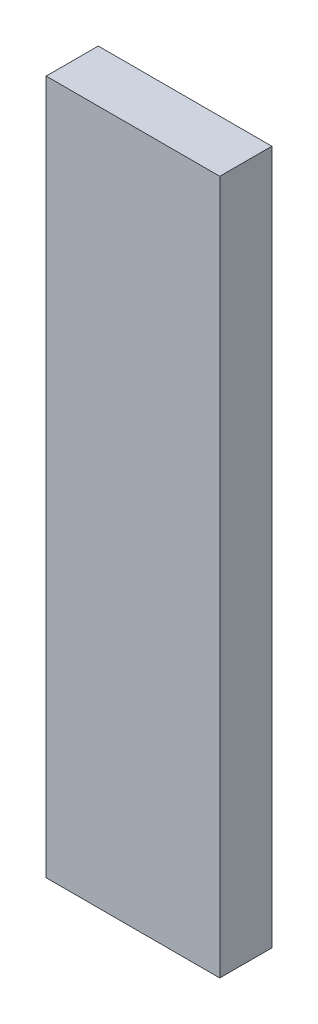
ISO-10303-21;
HEADER;
FILE_DESCRIPTION(('STEP AP214'),'2;1');
FILE_NAME('part.step','',(''),(''),'','','');
FILE_SCHEMA(('AUTOMOTIVE_DESIGN { 1 0 10303 214 1 1 1 1 }'));
ENDSEC;
DATA;
#1=APPLICATION_CONTEXT('core data for automotive mechanical design processes');
#2=APPLICATION_PROTOCOL_DEFINITION('international standard','automotive_design',2000,#1);
#3=PRODUCT_CONTEXT('',#1,'mechanical');
#4=PRODUCT('Part','Part','',(#3));
#5=PRODUCT_RELATED_PRODUCT_CATEGORY('part','',(#4));
#6=PRODUCT_DEFINITION_FORMATION('','',#4);
#7=PRODUCT_DEFINITION_CONTEXT('part definition',#1,'design');
#8=PRODUCT_DEFINITION('design','',#6,#7);
#9=PRODUCT_DEFINITION_SHAPE('','',#8);
#10=(LENGTH_UNIT() NAMED_UNIT(*) SI_UNIT(.MILLI.,.METRE.));
#11=(NAMED_UNIT(*) PLANE_ANGLE_UNIT() SI_UNIT($,.RADIAN.));
#12=(NAMED_UNIT(*) SI_UNIT($,.STERADIAN.) SOLID_ANGLE_UNIT());
#13=UNCERTAINTY_MEASURE_WITH_UNIT(LENGTH_MEASURE(1.E-05),#10,'distance_accuracy_value','');
#14=(GEOMETRIC_REPRESENTATION_CONTEXT(3) GLOBAL_UNCERTAINTY_ASSIGNED_CONTEXT((#13)) GLOBAL_UNIT_ASSIGNED_CONTEXT((#10,
#11,#12)) REPRESENTATION_CONTEXT('',''));
#15=CARTESIAN_POINT('',(0.,0.,0.));
#16=DIRECTION('',(0.,0.,1.));
#17=DIRECTION('',(1.,0.,0.));
#18=AXIS2_PLACEMENT_3D('',#15,#16,#17);
#19=CARTESIAN_POINT('',(-7.5,0.,4.5));
#20=DIRECTION('',(1.,0.,0.));
#21=DIRECTION('',(0.,0.,-1.));
#22=AXIS2_PLACEMENT_3D('',#19,#20,#21);
#23=PLANE('',#22);
#24=DIRECTION('',(0.,-1.,0.));
#25=VECTOR('',#24,1.);
#26=CARTESIAN_POINT('',(-7.5,0.,0.));
#27=LINE('',#26,#25);
#28=CARTESIAN_POINT('',(-7.5,60.,0.));
#29=VERTEX_POINT('',#28);
#30=CARTESIAN_POINT('',(-7.5,0.,0.));
#31=VERTEX_POINT('',#30);
#32=EDGE_CURVE('E102',#29,#31,#27,.T.);
#33=ORIENTED_EDGE('',*,*,#32,.T.);
#34=DIRECTION('',(0.,0.,-1.));
#35=VECTOR('',#34,1.);
#36=CARTESIAN_POINT('',(-7.5,0.,4.5));
#37=LINE('',#36,#35);
#38=CARTESIAN_POINT('',(-7.5,0.,4.5));
#39=VERTEX_POINT('',#38);
#40=EDGE_CURVE('E11',#39,#31,#37,.T.);
#41=ORIENTED_EDGE('',*,*,#40,.F.);
#42=DIRECTION('',(0.,-1.,0.));
#43=VECTOR('',#42,1.);
#44=CARTESIAN_POINT('',(-7.5,0.,4.5));
#45=LINE('',#44,#43);
#46=CARTESIAN_POINT('',(-7.5,60.,4.5));
#47=VERTEX_POINT('',#46);
#48=EDGE_CURVE('E88',#47,#39,#45,.T.);
#49=ORIENTED_EDGE('',*,*,#48,.F.);
#50=DIRECTION('',(0.,0.,-1.));
#51=VECTOR('',#50,1.);
#52=CARTESIAN_POINT('',(-7.5,60.,4.5));
#53=LINE('',#52,#51);
#54=EDGE_CURVE('E98',#47,#29,#53,.T.);
#55=ORIENTED_EDGE('',*,*,#54,.T.);
#56=EDGE_LOOP('',(#33,#41,#49,#55));
#57=FACE_BOUND('',#56,.T.);
#58=ADVANCED_FACE('F38',(#57),#23,.F.);
#59=CARTESIAN_POINT('',(7.5,0.,4.5));
#60=DIRECTION('',(0.,1.,0.));
#61=DIRECTION('',(0.,0.,1.));
#62=AXIS2_PLACEMENT_3D('',#59,#60,#61);
#63=PLANE('',#62);
#64=DIRECTION('',(1.,0.,0.));
#65=VECTOR('',#64,1.);
#66=CARTESIAN_POINT('',(7.5,0.,0.));
#67=LINE('',#66,#65);
#68=CARTESIAN_POINT('',(7.5,0.,0.));
#69=VERTEX_POINT('',#68);
#70=EDGE_CURVE('E93',#31,#69,#67,.T.);
#71=ORIENTED_EDGE('',*,*,#70,.T.);
#72=DIRECTION('',(0.,0.,-1.));
#73=VECTOR('',#72,1.);
#74=CARTESIAN_POINT('',(7.5,0.,4.5));
#75=LINE('',#74,#73);
#76=CARTESIAN_POINT('',(7.5,0.,4.5));
#77=VERTEX_POINT('',#76);
#78=EDGE_CURVE('E46',#77,#69,#75,.T.);
#79=ORIENTED_EDGE('',*,*,#78,.F.);
#80=DIRECTION('',(1.,0.,0.));
#81=VECTOR('',#80,1.);
#82=CARTESIAN_POINT('',(7.5,0.,4.5));
#83=LINE('',#82,#81);
#84=EDGE_CURVE('E82',#39,#77,#83,.T.);
#85=ORIENTED_EDGE('',*,*,#84,.F.);
#86=ORIENTED_EDGE('',*,*,#40,.T.);
#87=EDGE_LOOP('',(#71,#79,#85,#86));
#88=FACE_BOUND('',#87,.T.);
#89=ADVANCED_FACE('F92',(#88),#63,.F.);
#90=CARTESIAN_POINT('',(7.5,0.,4.5));
#91=DIRECTION('',(-1.,0.,0.));
#92=DIRECTION('',(0.,0.,1.));
#93=AXIS2_PLACEMENT_3D('',#90,#91,#92);
#94=PLANE('',#93);
#95=DIRECTION('',(0.,1.,0.));
#96=VECTOR('',#95,1.);
#97=CARTESIAN_POINT('',(7.5,0.,0.));
#98=LINE('',#97,#96);
#99=CARTESIAN_POINT('',(7.5,60.,0.));
#100=VERTEX_POINT('',#99);
#101=EDGE_CURVE('E106',#69,#100,#98,.T.);
#102=ORIENTED_EDGE('',*,*,#101,.T.);
#103=DIRECTION('',(0.,0.,-1.));
#104=VECTOR('',#103,1.);
#105=CARTESIAN_POINT('',(7.5,60.,4.5));
#106=LINE('',#105,#104);
#107=CARTESIAN_POINT('',(7.5,60.,4.5));
#108=VERTEX_POINT('',#107);
#109=EDGE_CURVE('E95',#108,#100,#106,.T.);
#110=ORIENTED_EDGE('',*,*,#109,.F.);
#111=DIRECTION('',(0.,1.,0.));
#112=VECTOR('',#111,1.);
#113=CARTESIAN_POINT('',(7.5,0.,4.5));
#114=LINE('',#113,#112);
#115=EDGE_CURVE('E85',#77,#108,#114,.T.);
#116=ORIENTED_EDGE('',*,*,#115,.F.);
#117=ORIENTED_EDGE('',*,*,#78,.T.);
#118=EDGE_LOOP('',(#102,#110,#116,#117));
#119=FACE_BOUND('',#118,.T.);
#120=ADVANCED_FACE('F96',(#119),#94,.F.);
#121=CARTESIAN_POINT('',(-7.5,60.,4.5));
#122=DIRECTION('',(0.,-1.,0.));
#123=DIRECTION('',(0.,0.,-1.));
#124=AXIS2_PLACEMENT_3D('',#121,#122,#123);
#125=PLANE('',#124);
#126=DIRECTION('',(-1.,0.,0.));
#127=VECTOR('',#126,1.);
#128=CARTESIAN_POINT('',(-7.5,60.,0.));
#129=LINE('',#128,#127);
#130=EDGE_CURVE('E71',#100,#29,#129,.T.);
#131=ORIENTED_EDGE('',*,*,#130,.T.);
#132=ORIENTED_EDGE('',*,*,#54,.F.);
#133=DIRECTION('',(-1.,0.,0.));
#134=VECTOR('',#133,1.);
#135=CARTESIAN_POINT('',(7.5,60.,4.5));
#136=LINE('',#135,#134);
#137=EDGE_CURVE('E54',#108,#47,#136,.T.);
#138=ORIENTED_EDGE('',*,*,#137,.F.);
#139=ORIENTED_EDGE('',*,*,#109,.T.);
#140=EDGE_LOOP('',(#131,#132,#138,#139));
#141=FACE_BOUND('',#140,.T.);
#142=ADVANCED_FACE('F110',(#141),#125,.F.);
#143=CARTESIAN_POINT('',(0.,0.,4.5));
#144=DIRECTION('',(0.,0.,-1.));
#145=DIRECTION('',(-1.,0.,0.));
#146=AXIS2_PLACEMENT_3D('',#143,#144,#145);
#147=PLANE('',#146);
#148=ORIENTED_EDGE('',*,*,#48,.T.);
#149=ORIENTED_EDGE('',*,*,#84,.T.);
#150=ORIENTED_EDGE('',*,*,#115,.T.);
#151=ORIENTED_EDGE('',*,*,#137,.T.);
#152=EDGE_LOOP('',(#148,#149,#150,#151));
#153=FACE_BOUND('',#152,.T.);
#154=ADVANCED_FACE('F83',(#153),#147,.F.);
#155=CARTESIAN_POINT('',(0.,0.,0.));
#156=DIRECTION('',(0.,0.,-1.));
#157=DIRECTION('',(-1.,0.,0.));
#158=AXIS2_PLACEMENT_3D('',#155,#156,#157);
#159=PLANE('',#158);
#160=ORIENTED_EDGE('',*,*,#32,.F.);
#161=ORIENTED_EDGE('',*,*,#130,.F.);
#162=ORIENTED_EDGE('',*,*,#101,.F.);
#163=ORIENTED_EDGE('',*,*,#70,.F.);
#164=EDGE_LOOP('',(#160,#161,#162,#163));
#165=FACE_BOUND('',#164,.T.);
#166=ADVANCED_FACE('F112',(#165),#159,.T.);
#167=CLOSED_SHELL('',(#58,#89,#120,#142,#154,#166));
#168=MANIFOLD_SOLID_BREP('B2',#167);
#169=ADVANCED_BREP_SHAPE_REPRESENTATION('',(#18,#168),#14);
#170=SHAPE_DEFINITION_REPRESENTATION(#9,#169);
ENDSEC;
END-ISO-10303-21;
